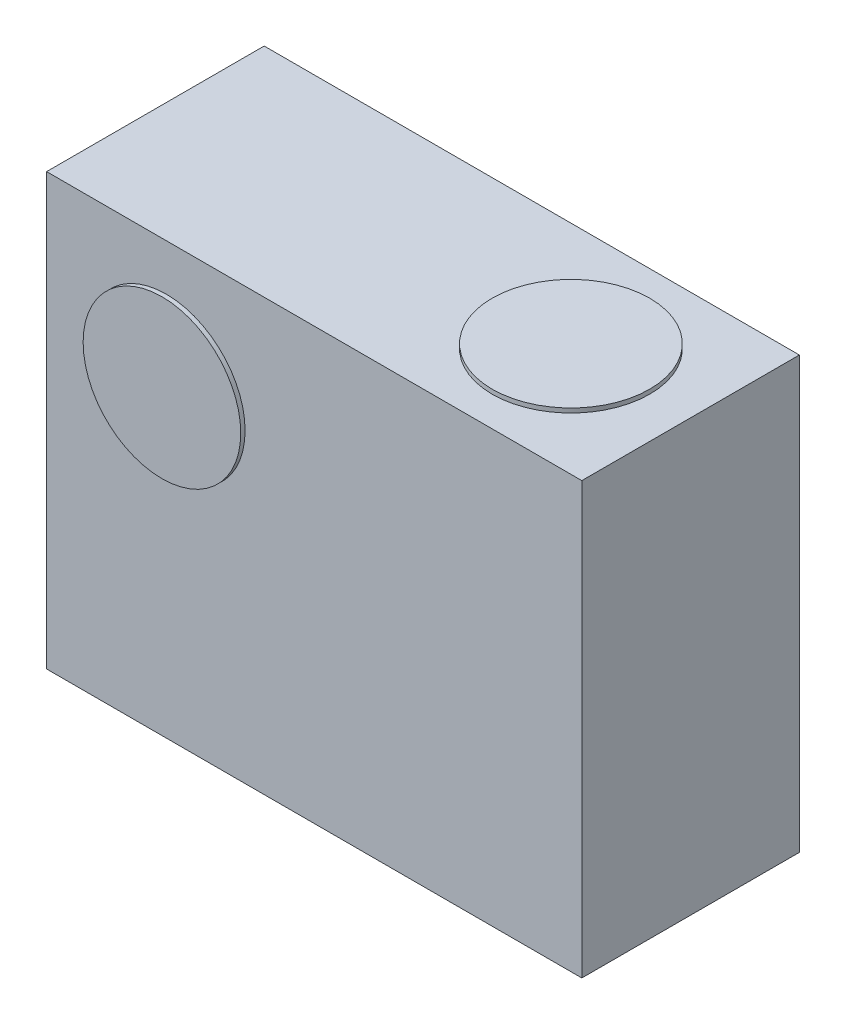
ISO-10303-21;
HEADER;
FILE_DESCRIPTION(('STEP AP214'),'2;1');
FILE_NAME('part.step','',(''),(''),'','','');
FILE_SCHEMA(('AUTOMOTIVE_DESIGN { 1 0 10303 214 1 1 1 1 }'));
ENDSEC;
DATA;
#1=APPLICATION_CONTEXT('core data for automotive mechanical design processes');
#2=APPLICATION_PROTOCOL_DEFINITION('international standard','automotive_design',2000,#1);
#3=PRODUCT_CONTEXT('',#1,'mechanical');
#4=PRODUCT('Part','Part','',(#3));
#5=PRODUCT_RELATED_PRODUCT_CATEGORY('part','',(#4));
#6=PRODUCT_DEFINITION_FORMATION('','',#4);
#7=PRODUCT_DEFINITION_CONTEXT('part definition',#1,'design');
#8=PRODUCT_DEFINITION('design','',#6,#7);
#9=PRODUCT_DEFINITION_SHAPE('','',#8);
#10=(LENGTH_UNIT() NAMED_UNIT(*) SI_UNIT(.MILLI.,.METRE.));
#11=(NAMED_UNIT(*) PLANE_ANGLE_UNIT() SI_UNIT($,.RADIAN.));
#12=(NAMED_UNIT(*) SI_UNIT($,.STERADIAN.) SOLID_ANGLE_UNIT());
#13=UNCERTAINTY_MEASURE_WITH_UNIT(LENGTH_MEASURE(1.E-05),#10,'distance_accuracy_value','');
#14=(GEOMETRIC_REPRESENTATION_CONTEXT(3) GLOBAL_UNCERTAINTY_ASSIGNED_CONTEXT((#13)) GLOBAL_UNIT_ASSIGNED_CONTEXT((#10,
#11,#12)) REPRESENTATION_CONTEXT('',''));
#15=CARTESIAN_POINT('',(0.,0.,0.));
#16=DIRECTION('',(0.,0.,1.));
#17=DIRECTION('',(1.,0.,0.));
#18=AXIS2_PLACEMENT_3D('',#15,#16,#17);
#19=CARTESIAN_POINT('',(105.327592081143,211.042591868596,-149.225));
#20=DIRECTION('',(1.,0.,0.));
#21=DIRECTION('',(0.,1.,0.));
#22=AXIS2_PLACEMENT_3D('',#19,#20,#21);
#23=PLANE('',#22);
#24=DIRECTION('',(0.,-1.,0.));
#25=VECTOR('',#24,1.);
#26=CARTESIAN_POINT('',(105.327592081143,211.042591868596,-152.4));
#27=LINE('',#26,#25);
#28=CARTESIAN_POINT('',(105.327592081143,236.442591868596,-152.4));
#29=VERTEX_POINT('',#28);
#30=CARTESIAN_POINT('',(105.327592081143,211.042591868596,-152.4));
#31=VERTEX_POINT('',#30);
#32=EDGE_CURVE('E121',#29,#31,#27,.T.);
#33=ORIENTED_EDGE('',*,*,#32,.T.);
#34=DIRECTION('',(0.,0.,-1.));
#35=VECTOR('',#34,1.);
#36=CARTESIAN_POINT('',(105.327592081143,211.042591868596,-149.225));
#37=LINE('',#36,#35);
#38=CARTESIAN_POINT('',(105.327592081143,211.042591868596,-149.225));
#39=VERTEX_POINT('',#38);
#40=EDGE_CURVE('E13',#39,#31,#37,.T.);
#41=ORIENTED_EDGE('',*,*,#40,.F.);
#42=DIRECTION('',(0.,-1.,0.));
#43=VECTOR('',#42,1.);
#44=CARTESIAN_POINT('',(105.327592081143,211.042591868596,-149.225));
#45=LINE('',#44,#43);
#46=CARTESIAN_POINT('',(105.327592081143,236.442591868596,-149.225));
#47=VERTEX_POINT('',#46);
#48=EDGE_CURVE('E108',#47,#39,#45,.T.);
#49=ORIENTED_EDGE('',*,*,#48,.F.);
#50=DIRECTION('',(0.,0.,-1.));
#51=VECTOR('',#50,1.);
#52=CARTESIAN_POINT('',(105.327592081143,236.442591868596,-149.225));
#53=LINE('',#52,#51);
#54=EDGE_CURVE('E119',#47,#29,#53,.T.);
#55=ORIENTED_EDGE('',*,*,#54,.T.);
#56=EDGE_LOOP('',(#33,#41,#49,#55));
#57=FACE_BOUND('',#56,.T.);
#58=ADVANCED_FACE('F59',(#57),#23,.F.);
#59=CARTESIAN_POINT('',(105.327592081143,211.042591868596,-149.225));
#60=DIRECTION('',(0.,1.,0.));
#61=DIRECTION('',(-1.,0.,0.));
#62=AXIS2_PLACEMENT_3D('',#59,#60,#61);
#63=PLANE('',#62);
#64=DIRECTION('',(1.,0.,0.));
#65=VECTOR('',#64,1.);
#66=CARTESIAN_POINT('',(105.327592081143,211.042591868596,-152.4));
#67=LINE('',#66,#65);
#68=CARTESIAN_POINT('',(130.727592081143,211.042591868596,-152.4));
#69=VERTEX_POINT('',#68);
#70=EDGE_CURVE('E114',#31,#69,#67,.T.);
#71=ORIENTED_EDGE('',*,*,#70,.T.);
#72=DIRECTION('',(0.,0.,-1.));
#73=VECTOR('',#72,1.);
#74=CARTESIAN_POINT('',(130.727592081143,211.042591868596,-149.225));
#75=LINE('',#74,#73);
#76=CARTESIAN_POINT('',(130.727592081143,211.042591868596,-149.225));
#77=VERTEX_POINT('',#76);
#78=EDGE_CURVE('E66',#77,#69,#75,.T.);
#79=ORIENTED_EDGE('',*,*,#78,.F.);
#80=DIRECTION('',(1.,0.,0.));
#81=VECTOR('',#80,1.);
#82=CARTESIAN_POINT('',(105.327592081143,211.042591868596,-149.225));
#83=LINE('',#82,#81);
#84=EDGE_CURVE('E102',#39,#77,#83,.T.);
#85=ORIENTED_EDGE('',*,*,#84,.F.);
#86=ORIENTED_EDGE('',*,*,#40,.T.);
#87=EDGE_LOOP('',(#71,#79,#85,#86));
#88=FACE_BOUND('',#87,.T.);
#89=ADVANCED_FACE('F115',(#88),#63,.F.);
#90=CARTESIAN_POINT('',(130.727592081143,211.042591868596,-149.225));
#91=DIRECTION('',(-1.,0.,0.));
#92=DIRECTION('',(0.,-1.,0.));
#93=AXIS2_PLACEMENT_3D('',#90,#91,#92);
#94=PLANE('',#93);
#95=DIRECTION('',(0.,1.,0.));
#96=VECTOR('',#95,1.);
#97=CARTESIAN_POINT('',(130.727592081143,211.042591868596,-152.4));
#98=LINE('',#97,#96);
#99=CARTESIAN_POINT('',(130.727592081143,236.442591868596,-152.4));
#100=VERTEX_POINT('',#99);
#101=EDGE_CURVE('E93',#69,#100,#98,.T.);
#102=ORIENTED_EDGE('',*,*,#101,.T.);
#103=DIRECTION('',(0.,0.,-1.));
#104=VECTOR('',#103,1.);
#105=CARTESIAN_POINT('',(130.727592081143,236.442591868596,-149.225));
#106=LINE('',#105,#104);
#107=CARTESIAN_POINT('',(130.727592081143,236.442591868596,-149.225));
#108=VERTEX_POINT('',#107);
#109=EDGE_CURVE('E111',#108,#100,#106,.T.);
#110=ORIENTED_EDGE('',*,*,#109,.F.);
#111=DIRECTION('',(0.,1.,0.));
#112=VECTOR('',#111,1.);
#113=CARTESIAN_POINT('',(130.727592081143,211.042591868596,-149.225));
#114=LINE('',#113,#112);
#115=EDGE_CURVE('E110',#77,#108,#114,.T.);
#116=ORIENTED_EDGE('',*,*,#115,.F.);
#117=ORIENTED_EDGE('',*,*,#78,.T.);
#118=EDGE_LOOP('',(#102,#110,#116,#117));
#119=FACE_BOUND('',#118,.T.);
#120=ADVANCED_FACE('F113',(#119),#94,.F.);
#121=CARTESIAN_POINT('',(105.327592081143,236.442591868596,-149.225));
#122=DIRECTION('',(0.,-1.,0.));
#123=DIRECTION('',(1.,0.,0.));
#124=AXIS2_PLACEMENT_3D('',#121,#122,#123);
#125=PLANE('',#124);
#126=DIRECTION('',(-1.,0.,0.));
#127=VECTOR('',#126,1.);
#128=CARTESIAN_POINT('',(105.327592081143,236.442591868596,-152.4));
#129=LINE('',#128,#127);
#130=EDGE_CURVE('E100',#100,#29,#129,.T.);
#131=ORIENTED_EDGE('',*,*,#130,.T.);
#132=ORIENTED_EDGE('',*,*,#54,.F.);
#133=DIRECTION('',(-1.,0.,0.));
#134=VECTOR('',#133,1.);
#135=CARTESIAN_POINT('',(105.327592081143,236.442591868596,-149.225));
#136=LINE('',#135,#134);
#137=EDGE_CURVE('E74',#108,#47,#136,.T.);
#138=ORIENTED_EDGE('',*,*,#137,.F.);
#139=ORIENTED_EDGE('',*,*,#109,.T.);
#140=EDGE_LOOP('',(#131,#132,#138,#139));
#141=FACE_BOUND('',#140,.T.);
#142=ADVANCED_FACE('F126',(#141),#125,.F.);
#143=CARTESIAN_POINT('',(105.327592081143,211.042591868596,-149.225));
#144=DIRECTION('',(0.,0.,-1.));
#145=DIRECTION('',(0.,1.,0.));
#146=AXIS2_PLACEMENT_3D('',#143,#144,#145);
#147=PLANE('',#146);
#148=ORIENTED_EDGE('',*,*,#48,.T.);
#149=ORIENTED_EDGE('',*,*,#84,.T.);
#150=ORIENTED_EDGE('',*,*,#115,.T.);
#151=ORIENTED_EDGE('',*,*,#137,.T.);
#152=EDGE_LOOP('',(#148,#149,#150,#151));
#153=FACE_BOUND('',#152,.T.);
#154=ADVANCED_FACE('F104',(#153),#147,.F.);
#155=CARTESIAN_POINT('',(105.327592081143,211.042591868596,-152.4));
#156=DIRECTION('',(0.,0.,-1.));
#157=DIRECTION('',(0.,1.,0.));
#158=AXIS2_PLACEMENT_3D('',#155,#156,#157);
#159=PLANE('',#158);
#160=ORIENTED_EDGE('',*,*,#32,.F.);
#161=ORIENTED_EDGE('',*,*,#130,.F.);
#162=ORIENTED_EDGE('',*,*,#101,.F.);
#163=ORIENTED_EDGE('',*,*,#70,.F.);
#164=EDGE_LOOP('',(#160,#161,#162,#163));
#165=FACE_BOUND('',#164,.T.);
#166=ADVANCED_FACE('F132',(#165),#159,.T.);
#167=CLOSED_SHELL('',(#58,#89,#120,#142,#154,#166));
#168=MANIFOLD_SOLID_BREP('B2',#167);
#169=CARTESIAN_POINT('',(454.025,0.,0.));
#170=DIRECTION('',(0.,-1.,0.));
#171=DIRECTION('',(-1.,0.,0.));
#172=AXIS2_PLACEMENT_3D('',#169,#170,#171);
#173=PLANE('',#172);
#174=CARTESIAN_POINT('',(101.6,0.,-85.725));
#175=DIRECTION('',(0.,1.,0.));
#176=DIRECTION('',(0.,0.,1.));
#177=AXIS2_PLACEMENT_3D('',#174,#175,#176);
#178=CIRCLE('',#177,57.5);
#179=CARTESIAN_POINT('',(101.6,0.,-28.225));
#180=VERTEX_POINT('',#179);
#181=EDGE_CURVE('E317',#180,#180,#178,.T.);
#182=ORIENTED_EDGE('',*,*,#181,.F.);
#183=EDGE_LOOP('',(#182));
#184=FACE_BOUND('',#183,.T.);
#185=ADVANCED_FACE('F181',(#184),#173,.T.);
#186=CARTESIAN_POINT('',(3.17500000000002,1.5875,-165.1));
#187=DIRECTION('',(0.,0.,-1.));
#188=DIRECTION('',(0.,1.,0.));
#189=AXIS2_PLACEMENT_3D('',#186,#187,#188);
#190=PLANE('',#189);
#191=CARTESIAN_POINT('',(354.0125,224.63125,-165.1));
#192=DIRECTION('',(0.,0.,1.));
#193=DIRECTION('',(0.,-1.,0.));
#194=AXIS2_PLACEMENT_3D('',#191,#192,#193);
#195=CIRCLE('',#194,57.5);
#196=CARTESIAN_POINT('',(354.0125,167.13125,-165.1));
#197=VERTEX_POINT('',#196);
#198=EDGE_CURVE('E281',#197,#197,#195,.T.);
#199=ORIENTED_EDGE('',*,*,#198,.T.);
#200=EDGE_LOOP('',(#199));
#201=FACE_BOUND('',#200,.T.);
#202=DIRECTION('',(0.,-1.,0.));
#203=VECTOR('',#202,1.);
#204=CARTESIAN_POINT('',(422.275,319.0875,-165.1));
#205=LINE('',#204,#203);
#206=CARTESIAN_POINT('',(422.275,315.9125,-165.1));
#207=VERTEX_POINT('',#206);
#208=CARTESIAN_POINT('',(422.275,1.58750000000002,-165.1));
#209=VERTEX_POINT('',#208);
#210=EDGE_CURVE('E284',#207,#209,#205,.T.);
#211=ORIENTED_EDGE('',*,*,#210,.T.);
#212=DIRECTION('',(-1.,0.,0.));
#213=VECTOR('',#212,1.);
#214=CARTESIAN_POINT('',(3.17500000000002,1.5875,-165.1));
#215=LINE('',#214,#213);
#216=CARTESIAN_POINT('',(31.75,1.58749999999996,-165.1));
#217=VERTEX_POINT('',#216);
#218=EDGE_CURVE('E262',#209,#217,#215,.T.);
#219=ORIENTED_EDGE('',*,*,#218,.T.);
#220=DIRECTION('',(0.,-1.,0.));
#221=VECTOR('',#220,1.);
#222=CARTESIAN_POINT('',(31.75,319.0875,-165.1));
#223=LINE('',#222,#221);
#224=CARTESIAN_POINT('',(31.75,315.9125,-165.1));
#225=VERTEX_POINT('',#224);
#226=EDGE_CURVE('E254',#225,#217,#223,.T.);
#227=ORIENTED_EDGE('',*,*,#226,.F.);
#228=DIRECTION('',(-1.,0.,0.));
#229=VECTOR('',#228,1.);
#230=CARTESIAN_POINT('',(31.75,315.9125,-165.1));
#231=LINE('',#230,#229);
#232=EDGE_CURVE('E260',#207,#225,#231,.T.);
#233=ORIENTED_EDGE('',*,*,#232,.F.);
#234=EDGE_LOOP('',(#211,#219,#227,#233));
#235=FACE_BOUND('',#234,.T.);
#236=ADVANCED_FACE('F261',(#201,#235),#190,.T.);
#237=CARTESIAN_POINT('',(354.0125,224.63125,-168.275));
#238=DIRECTION('',(0.,0.,1.));
#239=DIRECTION('',(0.,-1.,0.));
#240=AXIS2_PLACEMENT_3D('',#237,#238,#239);
#241=CYLINDRICAL_SURFACE('',#240,57.5);
#242=CARTESIAN_POINT('',(354.0125,224.63125,-168.275));
#243=DIRECTION('',(0.,0.,-1.));
#244=DIRECTION('',(0.,1.,0.));
#245=AXIS2_PLACEMENT_3D('',#242,#243,#244);
#246=CIRCLE('',#245,57.5);
#247=CARTESIAN_POINT('',(354.0125,282.13125,-168.275));
#248=VERTEX_POINT('',#247);
#249=EDGE_CURVE('E273',#248,#248,#246,.F.);
#250=ORIENTED_EDGE('',*,*,#249,.T.);
#251=EDGE_LOOP('',(#250));
#252=FACE_BOUND('',#251,.T.);
#253=ORIENTED_EDGE('',*,*,#198,.F.);
#254=EDGE_LOOP('',(#253));
#255=FACE_BOUND('',#254,.T.);
#256=ADVANCED_FACE('F341',(#252,#255),#241,.T.);
#257=CARTESIAN_POINT('',(0.,1.5875,0.));
#258=DIRECTION('',(0.,-1.,0.));
#259=DIRECTION('',(0.,0.,-1.));
#260=AXIS2_PLACEMENT_3D('',#257,#258,#259);
#261=PLANE('',#260);
#262=CARTESIAN_POINT('',(101.6,1.5875,-85.725));
#263=DIRECTION('',(0.,1.,0.));
#264=DIRECTION('',(0.,0.,1.));
#265=AXIS2_PLACEMENT_3D('',#262,#263,#264);
#266=CIRCLE('',#265,57.5);
#267=CARTESIAN_POINT('',(101.6,1.5875,-28.225));
#268=VERTEX_POINT('',#267);
#269=EDGE_CURVE('E277',#268,#268,#266,.T.);
#270=ORIENTED_EDGE('',*,*,#269,.T.);
#271=EDGE_LOOP('',(#270));
#272=FACE_BOUND('',#271,.T.);
#273=DIRECTION('',(0.,0.,1.));
#274=VECTOR('',#273,1.);
#275=CARTESIAN_POINT('',(422.275,1.58750000000002,-6.35000000000007));
#276=LINE('',#275,#274);
#277=CARTESIAN_POINT('',(422.275,1.58750000000003,-6.35000000000009));
#278=VERTEX_POINT('',#277);
#279=EDGE_CURVE('E278',#209,#278,#276,.T.);
#280=ORIENTED_EDGE('',*,*,#279,.T.);
#281=DIRECTION('',(1.,0.,0.));
#282=VECTOR('',#281,1.);
#283=CARTESIAN_POINT('',(404.8125,1.58750000000003,-6.35000000000009));
#284=LINE('',#283,#282);
#285=CARTESIAN_POINT('',(31.75,1.58749999999996,-6.34999999999996));
#286=VERTEX_POINT('',#285);
#287=EDGE_CURVE('E322',#286,#278,#284,.T.);
#288=ORIENTED_EDGE('',*,*,#287,.F.);
#289=DIRECTION('',(0.,0.,1.));
#290=VECTOR('',#289,1.);
#291=CARTESIAN_POINT('',(31.75,1.58749999999996,-6.34999999999996));
#292=LINE('',#291,#290);
#293=EDGE_CURVE('E266',#217,#286,#292,.T.);
#294=ORIENTED_EDGE('',*,*,#293,.F.);
#295=ORIENTED_EDGE('',*,*,#218,.F.);
#296=EDGE_LOOP('',(#280,#288,#294,#295));
#297=FACE_BOUND('',#296,.T.);
#298=ADVANCED_FACE('F336',(#272,#297),#261,.T.);
#299=CARTESIAN_POINT('',(422.275,319.0875,-6.35000000000006));
#300=DIRECTION('',(1.,0.,0.));
#301=DIRECTION('',(0.,-1.,0.));
#302=AXIS2_PLACEMENT_3D('',#299,#300,#301);
#303=PLANE('',#302);
#304=DIRECTION('',(0.,1.,0.));
#305=VECTOR('',#304,1.);
#306=CARTESIAN_POINT('',(422.275,319.0875,-6.35000000000006));
#307=LINE('',#306,#305);
#308=CARTESIAN_POINT('',(422.275,315.9125,-6.35000000000006));
#309=VERTEX_POINT('',#308);
#310=EDGE_CURVE('E321',#278,#309,#307,.T.);
#311=ORIENTED_EDGE('',*,*,#310,.F.);
#312=ORIENTED_EDGE('',*,*,#279,.F.);
#313=ORIENTED_EDGE('',*,*,#210,.F.);
#314=DIRECTION('',(0.,0.,-1.));
#315=VECTOR('',#314,1.);
#316=CARTESIAN_POINT('',(422.275,315.9125,-165.1));
#317=LINE('',#316,#315);
#318=EDGE_CURVE('E192',#309,#207,#317,.T.);
#319=ORIENTED_EDGE('',*,*,#318,.F.);
#320=EDGE_LOOP('',(#311,#312,#313,#319));
#321=FACE_BOUND('',#320,.T.);
#322=ADVANCED_FACE('F339',(#321),#303,.T.);
#323=CARTESIAN_POINT('',(101.6,0.,-85.725));
#324=DIRECTION('',(0.,1.,0.));
#325=DIRECTION('',(0.,0.,1.));
#326=AXIS2_PLACEMENT_3D('',#323,#324,#325);
#327=CYLINDRICAL_SURFACE('',#326,57.5);
#328=ORIENTED_EDGE('',*,*,#181,.T.);
#329=EDGE_LOOP('',(#328));
#330=FACE_BOUND('',#329,.T.);
#331=ORIENTED_EDGE('',*,*,#269,.F.);
#332=EDGE_LOOP('',(#331));
#333=FACE_BOUND('',#332,.T.);
#334=ADVANCED_FACE('F346',(#330,#333),#327,.T.);
#335=CARTESIAN_POINT('',(3.17500000000004,1.58750000000002,-6.35000000000005));
#336=DIRECTION('',(0.,0.,-1.));
#337=DIRECTION('',(0.,1.,0.));
#338=AXIS2_PLACEMENT_3D('',#335,#336,#337);
#339=PLANE('',#338);
#340=DIRECTION('',(1.,0.,0.));
#341=VECTOR('',#340,1.);
#342=CARTESIAN_POINT('',(31.75,315.9125,-6.35000000000005));
#343=LINE('',#342,#341);
#344=CARTESIAN_POINT('',(31.75,315.9125,-6.34999999999996));
#345=VERTEX_POINT('',#344);
#346=EDGE_CURVE('E258',#345,#309,#343,.T.);
#347=ORIENTED_EDGE('',*,*,#346,.F.);
#348=DIRECTION('',(0.,1.,0.));
#349=VECTOR('',#348,1.);
#350=CARTESIAN_POINT('',(31.75,319.0875,-6.34999999999996));
#351=LINE('',#350,#349);
#352=EDGE_CURVE('E246',#286,#345,#351,.T.);
#353=ORIENTED_EDGE('',*,*,#352,.F.);
#354=ORIENTED_EDGE('',*,*,#287,.T.);
#355=ORIENTED_EDGE('',*,*,#310,.T.);
#356=EDGE_LOOP('',(#347,#353,#354,#355));
#357=FACE_BOUND('',#356,.T.);
#358=CARTESIAN_POINT('',(119.0625,224.63125,-6.35000000000007));
#359=DIRECTION('',(0.,0.,1.));
#360=DIRECTION('',(0.,-1.,0.));
#361=AXIS2_PLACEMENT_3D('',#358,#359,#360);
#362=CIRCLE('',#361,57.5);
#363=CARTESIAN_POINT('',(119.0625,167.13125,-6.35000000000006));
#364=VERTEX_POINT('',#363);
#365=EDGE_CURVE('E323',#364,#364,#362,.T.);
#366=ORIENTED_EDGE('',*,*,#365,.F.);
#367=EDGE_LOOP('',(#366));
#368=FACE_BOUND('',#367,.T.);
#369=ADVANCED_FACE('F334',(#357,#368),#339,.F.);
#370=CARTESIAN_POINT('',(119.0625,224.63125,-6.35000000000007));
#371=DIRECTION('',(0.,0.,1.));
#372=DIRECTION('',(0.,-1.,0.));
#373=AXIS2_PLACEMENT_3D('',#370,#371,#372);
#374=CYLINDRICAL_SURFACE('',#373,57.5);
#375=ORIENTED_EDGE('',*,*,#365,.T.);
#376=EDGE_LOOP('',(#375));
#377=FACE_BOUND('',#376,.T.);
#378=CARTESIAN_POINT('',(119.0625,224.63125,-3.17500000000008));
#379=DIRECTION('',(0.,0.,1.));
#380=DIRECTION('',(0.,-1.,0.));
#381=AXIS2_PLACEMENT_3D('',#378,#379,#380);
#382=CIRCLE('',#381,57.5);
#383=CARTESIAN_POINT('',(119.0625,167.13125,-3.17500000000007));
#384=VERTEX_POINT('',#383);
#385=EDGE_CURVE('E189',#384,#384,#382,.F.);
#386=ORIENTED_EDGE('',*,*,#385,.T.);
#387=EDGE_LOOP('',(#386));
#388=FACE_BOUND('',#387,.T.);
#389=ADVANCED_FACE('F492',(#377,#388),#374,.T.);
#390=CARTESIAN_POINT('',(31.75,319.0875,-6.34999999999996));
#391=DIRECTION('',(1.,0.,0.));
#392=DIRECTION('',(0.,-1.,0.));
#393=AXIS2_PLACEMENT_3D('',#390,#391,#392);
#394=PLANE('',#393);
#395=DIRECTION('',(0.,0.,1.));
#396=VECTOR('',#395,1.);
#397=CARTESIAN_POINT('',(31.75,315.9125,-165.1));
#398=LINE('',#397,#396);
#399=EDGE_CURVE('E253',#225,#345,#398,.T.);
#400=ORIENTED_EDGE('',*,*,#399,.F.);
#401=ORIENTED_EDGE('',*,*,#226,.T.);
#402=ORIENTED_EDGE('',*,*,#293,.T.);
#403=ORIENTED_EDGE('',*,*,#352,.T.);
#404=EDGE_LOOP('',(#400,#401,#402,#403));
#405=FACE_BOUND('',#404,.T.);
#406=ADVANCED_FACE('F251',(#405),#394,.F.);
#407=CARTESIAN_POINT('',(334.9625,315.9125,-85.7250000000001));
#408=DIRECTION('',(0.,1.,0.));
#409=DIRECTION('',(-1.,0.,0.));
#410=AXIS2_PLACEMENT_3D('',#407,#408,#409);
#411=CYLINDRICAL_SURFACE('',#410,57.5);
#412=CARTESIAN_POINT('',(334.9625,315.9125,-85.7250000000001));
#413=DIRECTION('',(0.,1.,0.));
#414=DIRECTION('',(-1.,0.,0.));
#415=AXIS2_PLACEMENT_3D('',#412,#413,#414);
#416=CIRCLE('',#415,57.5);
#417=CARTESIAN_POINT('',(277.4625,315.9125,-85.7250000000001));
#418=VERTEX_POINT('',#417);
#419=EDGE_CURVE('E267',#418,#418,#416,.T.);
#420=ORIENTED_EDGE('',*,*,#419,.T.);
#421=EDGE_LOOP('',(#420));
#422=FACE_BOUND('',#421,.T.);
#423=CARTESIAN_POINT('',(334.9625,319.0875,-85.7250000000001));
#424=DIRECTION('',(0.,1.,0.));
#425=DIRECTION('',(-1.,0.,0.));
#426=AXIS2_PLACEMENT_3D('',#423,#424,#425);
#427=CIRCLE('',#426,57.5);
#428=CARTESIAN_POINT('',(277.4625,319.0875,-85.7250000000001));
#429=VERTEX_POINT('',#428);
#430=EDGE_CURVE('E57',#429,#429,#427,.T.);
#431=ORIENTED_EDGE('',*,*,#430,.F.);
#432=EDGE_LOOP('',(#431));
#433=FACE_BOUND('',#432,.T.);
#434=ADVANCED_FACE('F473',(#422,#433),#411,.T.);
#435=CARTESIAN_POINT('',(31.75,315.9125,-165.1));
#436=DIRECTION('',(0.,-1.,0.));
#437=DIRECTION('',(1.,0.,0.));
#438=AXIS2_PLACEMENT_3D('',#435,#436,#437);
#439=PLANE('',#438);
#440=ORIENTED_EDGE('',*,*,#419,.F.);
#441=EDGE_LOOP('',(#440));
#442=FACE_BOUND('',#441,.T.);
#443=ORIENTED_EDGE('',*,*,#232,.T.);
#444=ORIENTED_EDGE('',*,*,#399,.T.);
#445=ORIENTED_EDGE('',*,*,#346,.T.);
#446=ORIENTED_EDGE('',*,*,#318,.T.);
#447=EDGE_LOOP('',(#443,#444,#445,#446));
#448=FACE_BOUND('',#447,.T.);
#449=ADVANCED_FACE('F268',(#442,#448),#439,.F.);
#450=CARTESIAN_POINT('',(454.025,319.0875,0.));
#451=DIRECTION('',(0.,-1.,0.));
#452=DIRECTION('',(-1.,0.,0.));
#453=AXIS2_PLACEMENT_3D('',#450,#451,#452);
#454=PLANE('',#453);
#455=ORIENTED_EDGE('',*,*,#430,.T.);
#456=EDGE_LOOP('',(#455));
#457=FACE_BOUND('',#456,.T.);
#458=ADVANCED_FACE('F183',(#457),#454,.F.);
#459=CARTESIAN_POINT('',(31.7499999999999,0.,-3.17500000000004));
#460=DIRECTION('',(0.,0.,1.));
#461=DIRECTION('',(0.,-1.,0.));
#462=AXIS2_PLACEMENT_3D('',#459,#460,#461);
#463=PLANE('',#462);
#464=ORIENTED_EDGE('',*,*,#385,.F.);
#465=EDGE_LOOP('',(#464));
#466=FACE_BOUND('',#465,.T.);
#467=ADVANCED_FACE('F412',(#466),#463,.T.);
#468=CARTESIAN_POINT('',(31.75,0.,-168.275));
#469=DIRECTION('',(0.,0.,-1.));
#470=DIRECTION('',(0.,1.,0.));
#471=AXIS2_PLACEMENT_3D('',#468,#469,#470);
#472=PLANE('',#471);
#473=ORIENTED_EDGE('',*,*,#249,.F.);
#474=EDGE_LOOP('',(#473));
#475=FACE_BOUND('',#474,.T.);
#476=ADVANCED_FACE('F420',(#475),#472,.T.);
#477=CLOSED_SHELL('',(#185,#236,#256,#298,#322,#334,#369,#389,#406,#434,#449,#458,#467,#476));
#478=CARTESIAN_POINT('',(105.327592081143,211.042591868596,-149.225));
#479=DIRECTION('',(1.,0.,0.));
#480=DIRECTION('',(0.,1.,0.));
#481=AXIS2_PLACEMENT_3D('',#478,#479,#480);
#482=PLANE('',#481);
#483=DIRECTION('',(0.,-1.,0.));
#484=VECTOR('',#483,1.);
#485=CARTESIAN_POINT('',(105.327592081143,211.042591868596,-152.4));
#486=LINE('',#485,#484);
#487=CARTESIAN_POINT('',(105.327592081143,236.442591868596,-152.4));
#488=VERTEX_POINT('',#487);
#489=CARTESIAN_POINT('',(105.327592081143,211.042591868596,-152.4));
#490=VERTEX_POINT('',#489);
#491=EDGE_CURVE('E302',#488,#490,#486,.T.);
#492=ORIENTED_EDGE('',*,*,#491,.F.);
#493=DIRECTION('',(0.,0.,-1.));
#494=VECTOR('',#493,1.);
#495=CARTESIAN_POINT('',(105.327592081143,236.442591868596,-149.225));
#496=LINE('',#495,#494);
#497=CARTESIAN_POINT('',(105.327592081143,236.442591868596,-149.225));
#498=VERTEX_POINT('',#497);
#499=EDGE_CURVE('E301',#498,#488,#496,.T.);
#500=ORIENTED_EDGE('',*,*,#499,.F.);
#501=DIRECTION('',(0.,-1.,0.));
#502=VECTOR('',#501,1.);
#503=CARTESIAN_POINT('',(105.327592081143,211.042591868596,-149.225));
#504=LINE('',#503,#502);
#505=CARTESIAN_POINT('',(105.327592081143,211.042591868596,-149.225));
#506=VERTEX_POINT('',#505);
#507=EDGE_CURVE('E295',#498,#506,#504,.T.);
#508=ORIENTED_EDGE('',*,*,#507,.T.);
#509=DIRECTION('',(0.,0.,-1.));
#510=VECTOR('',#509,1.);
#511=CARTESIAN_POINT('',(105.327592081143,211.042591868596,-149.225));
#512=LINE('',#511,#510);
#513=EDGE_CURVE('E288',#506,#490,#512,.T.);
#514=ORIENTED_EDGE('',*,*,#513,.T.);
#515=EDGE_LOOP('',(#492,#500,#508,#514));
#516=FACE_BOUND('',#515,.T.);
#517=ADVANCED_FACE('F362',(#516),#482,.T.);
#518=CARTESIAN_POINT('',(105.327592081143,211.042591868596,-149.225));
#519=DIRECTION('',(0.,1.,0.));
#520=DIRECTION('',(-1.,0.,0.));
#521=AXIS2_PLACEMENT_3D('',#518,#519,#520);
#522=PLANE('',#521);
#523=DIRECTION('',(1.,0.,0.));
#524=VECTOR('',#523,1.);
#525=CARTESIAN_POINT('',(105.327592081143,211.042591868596,-152.4));
#526=LINE('',#525,#524);
#527=CARTESIAN_POINT('',(130.727592081143,211.042591868596,-152.4));
#528=VERTEX_POINT('',#527);
#529=EDGE_CURVE('E310',#490,#528,#526,.T.);
#530=ORIENTED_EDGE('',*,*,#529,.F.);
#531=ORIENTED_EDGE('',*,*,#513,.F.);
#532=DIRECTION('',(1.,0.,0.));
#533=VECTOR('',#532,1.);
#534=CARTESIAN_POINT('',(105.327592081143,211.042591868596,-149.225));
#535=LINE('',#534,#533);
#536=CARTESIAN_POINT('',(130.727592081143,211.042591868596,-149.225));
#537=VERTEX_POINT('',#536);
#538=EDGE_CURVE('E292',#506,#537,#535,.T.);
#539=ORIENTED_EDGE('',*,*,#538,.T.);
#540=DIRECTION('',(0.,0.,-1.));
#541=VECTOR('',#540,1.);
#542=CARTESIAN_POINT('',(130.727592081143,211.042591868596,-149.225));
#543=LINE('',#542,#541);
#544=EDGE_CURVE('E291',#537,#528,#543,.T.);
#545=ORIENTED_EDGE('',*,*,#544,.T.);
#546=EDGE_LOOP('',(#530,#531,#539,#545));
#547=FACE_BOUND('',#546,.T.);
#548=ADVANCED_FACE('F364',(#547),#522,.T.);
#549=CARTESIAN_POINT('',(130.727592081143,211.042591868596,-149.225));
#550=DIRECTION('',(-1.,0.,0.));
#551=DIRECTION('',(0.,-1.,0.));
#552=AXIS2_PLACEMENT_3D('',#549,#550,#551);
#553=PLANE('',#552);
#554=DIRECTION('',(0.,1.,0.));
#555=VECTOR('',#554,1.);
#556=CARTESIAN_POINT('',(130.727592081143,211.042591868596,-152.4));
#557=LINE('',#556,#555);
#558=CARTESIAN_POINT('',(130.727592081143,236.442591868596,-152.4));
#559=VERTEX_POINT('',#558);
#560=EDGE_CURVE('E307',#528,#559,#557,.T.);
#561=ORIENTED_EDGE('',*,*,#560,.F.);
#562=ORIENTED_EDGE('',*,*,#544,.F.);
#563=DIRECTION('',(0.,1.,0.));
#564=VECTOR('',#563,1.);
#565=CARTESIAN_POINT('',(130.727592081143,211.042591868596,-149.225));
#566=LINE('',#565,#564);
#567=CARTESIAN_POINT('',(130.727592081143,236.442591868596,-149.225));
#568=VERTEX_POINT('',#567);
#569=EDGE_CURVE('E297',#537,#568,#566,.T.);
#570=ORIENTED_EDGE('',*,*,#569,.T.);
#571=DIRECTION('',(0.,0.,-1.));
#572=VECTOR('',#571,1.);
#573=CARTESIAN_POINT('',(130.727592081143,236.442591868596,-149.225));
#574=LINE('',#573,#572);
#575=EDGE_CURVE('E299',#568,#559,#574,.T.);
#576=ORIENTED_EDGE('',*,*,#575,.T.);
#577=EDGE_LOOP('',(#561,#562,#570,#576));
#578=FACE_BOUND('',#577,.T.);
#579=ADVANCED_FACE('F367',(#578),#553,.T.);
#580=CARTESIAN_POINT('',(105.327592081143,236.442591868596,-149.225));
#581=DIRECTION('',(0.,-1.,0.));
#582=DIRECTION('',(1.,0.,0.));
#583=AXIS2_PLACEMENT_3D('',#580,#581,#582);
#584=PLANE('',#583);
#585=DIRECTION('',(-1.,0.,0.));
#586=VECTOR('',#585,1.);
#587=CARTESIAN_POINT('',(105.327592081143,236.442591868596,-152.4));
#588=LINE('',#587,#586);
#589=EDGE_CURVE('E304',#559,#488,#588,.T.);
#590=ORIENTED_EDGE('',*,*,#589,.F.);
#591=ORIENTED_EDGE('',*,*,#575,.F.);
#592=DIRECTION('',(-1.,0.,0.));
#593=VECTOR('',#592,1.);
#594=CARTESIAN_POINT('',(105.327592081143,236.442591868596,-149.225));
#595=LINE('',#594,#593);
#596=EDGE_CURVE('E298',#568,#498,#595,.T.);
#597=ORIENTED_EDGE('',*,*,#596,.T.);
#598=ORIENTED_EDGE('',*,*,#499,.T.);
#599=EDGE_LOOP('',(#590,#591,#597,#598));
#600=FACE_BOUND('',#599,.T.);
#601=ADVANCED_FACE('F372',(#600),#584,.T.);
#602=CARTESIAN_POINT('',(105.327592081143,211.042591868596,-149.225));
#603=DIRECTION('',(0.,0.,-1.));
#604=DIRECTION('',(0.,1.,0.));
#605=AXIS2_PLACEMENT_3D('',#602,#603,#604);
#606=PLANE('',#605);
#607=ORIENTED_EDGE('',*,*,#507,.F.);
#608=ORIENTED_EDGE('',*,*,#596,.F.);
#609=ORIENTED_EDGE('',*,*,#569,.F.);
#610=ORIENTED_EDGE('',*,*,#538,.F.);
#611=EDGE_LOOP('',(#607,#608,#609,#610));
#612=FACE_BOUND('',#611,.T.);
#613=ADVANCED_FACE('F378',(#612),#606,.T.);
#614=CARTESIAN_POINT('',(105.327592081143,211.042591868596,-152.4));
#615=DIRECTION('',(0.,0.,-1.));
#616=DIRECTION('',(0.,1.,0.));
#617=AXIS2_PLACEMENT_3D('',#614,#615,#616);
#618=PLANE('',#617);
#619=ORIENTED_EDGE('',*,*,#491,.T.);
#620=ORIENTED_EDGE('',*,*,#529,.T.);
#621=ORIENTED_EDGE('',*,*,#560,.T.);
#622=ORIENTED_EDGE('',*,*,#589,.T.);
#623=EDGE_LOOP('',(#619,#620,#621,#622));
#624=FACE_BOUND('',#623,.T.);
#625=ADVANCED_FACE('F379',(#624),#618,.F.);
#626=CLOSED_SHELL('',(#517,#548,#579,#601,#613,#625));
#627=ORIENTED_CLOSED_SHELL('',*,#626,.T.);
#628=BREP_WITH_VOIDS('B7',#477,(#627));
#629=ADVANCED_BREP_SHAPE_REPRESENTATION('',(#18,#168,#628),#14);
#630=SHAPE_DEFINITION_REPRESENTATION(#9,#629);
ENDSEC;
END-ISO-10303-21;
